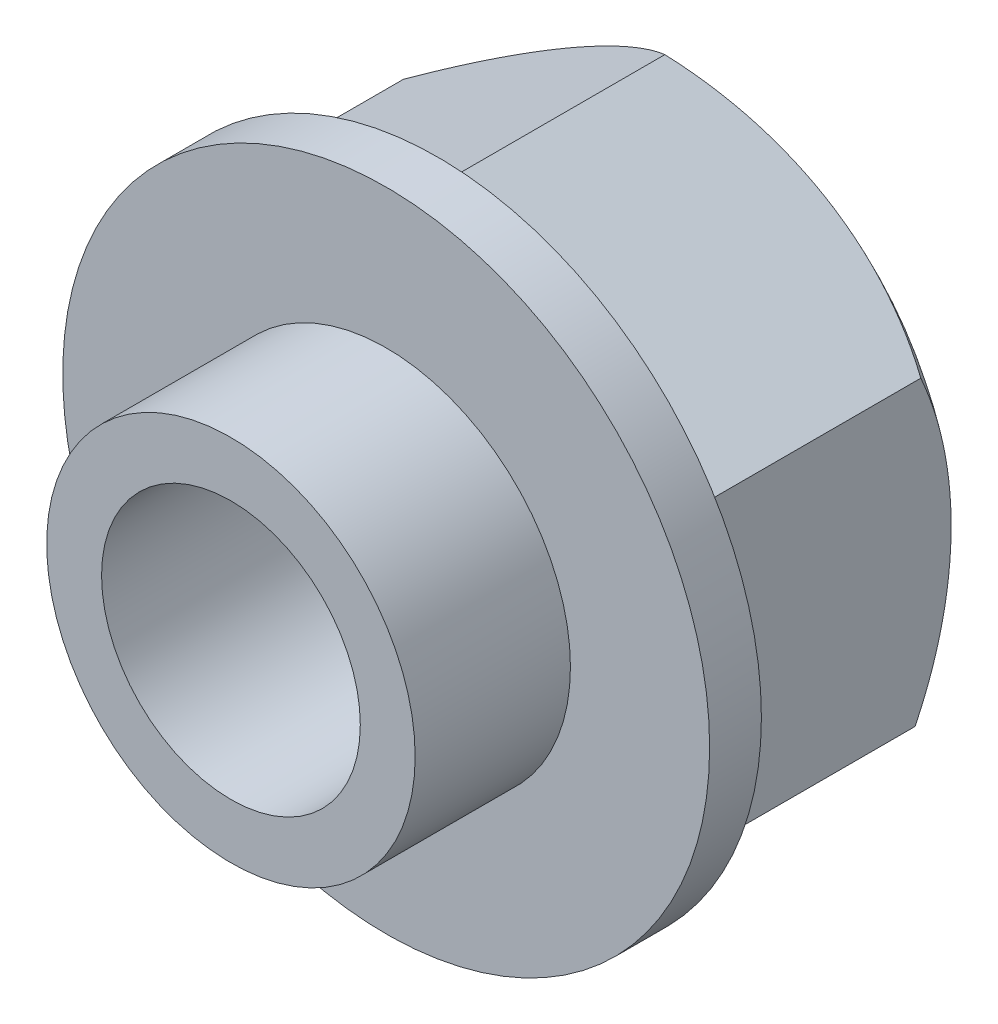
ISO-10303-21;
HEADER;
FILE_DESCRIPTION(('STEP AP214'),'2;1');
FILE_NAME('part.step','',(''),(''),'','','');
FILE_SCHEMA(('AUTOMOTIVE_DESIGN { 1 0 10303 214 1 1 1 1 }'));
ENDSEC;
DATA;
#1=APPLICATION_CONTEXT('core data for automotive mechanical design processes');
#2=APPLICATION_PROTOCOL_DEFINITION('international standard','automotive_design',2000,#1);
#3=PRODUCT_CONTEXT('',#1,'mechanical');
#4=PRODUCT('Part','Part','',(#3));
#5=PRODUCT_RELATED_PRODUCT_CATEGORY('part','',(#4));
#6=PRODUCT_DEFINITION_FORMATION('','',#4);
#7=PRODUCT_DEFINITION_CONTEXT('part definition',#1,'design');
#8=PRODUCT_DEFINITION('design','',#6,#7);
#9=PRODUCT_DEFINITION_SHAPE('','',#8);
#10=(LENGTH_UNIT() NAMED_UNIT(*) SI_UNIT(.MILLI.,.METRE.));
#11=(NAMED_UNIT(*) PLANE_ANGLE_UNIT() SI_UNIT($,.RADIAN.));
#12=(NAMED_UNIT(*) SI_UNIT($,.STERADIAN.) SOLID_ANGLE_UNIT());
#13=UNCERTAINTY_MEASURE_WITH_UNIT(LENGTH_MEASURE(1.E-05),#10,'distance_accuracy_value','');
#14=(GEOMETRIC_REPRESENTATION_CONTEXT(3) GLOBAL_UNCERTAINTY_ASSIGNED_CONTEXT((#13)) GLOBAL_UNIT_ASSIGNED_CONTEXT((#10,
#11,#12)) REPRESENTATION_CONTEXT('',''));
#15=CARTESIAN_POINT('',(0.,0.,0.));
#16=DIRECTION('',(0.,0.,1.));
#17=DIRECTION('',(1.,0.,0.));
#18=AXIS2_PLACEMENT_3D('',#15,#16,#17);
#19=CARTESIAN_POINT('',(0.,0.,0.));
#20=DIRECTION('',(0.,0.,1.));
#21=DIRECTION('',(1.,0.,0.));
#22=AXIS2_PLACEMENT_3D('',#19,#20,#21);
#23=PLANE('',#22);
#24=CARTESIAN_POINT('',(0.,0.,0.));
#25=DIRECTION('',(0.,0.,1.));
#26=DIRECTION('',(-1.,0.,0.));
#27=AXIS2_PLACEMENT_3D('',#24,#25,#26);
#28=CIRCLE('',#27,2.5);
#29=CARTESIAN_POINT('',(2.5,0.,0.));
#30=VERTEX_POINT('',#29);
#31=EDGE_CURVE('E181',#30,#30,#28,.T.);
#32=ORIENTED_EDGE('',*,*,#31,.T.);
#33=EDGE_LOOP('',(#32));
#34=FACE_BOUND('',#33,.T.);
#35=CARTESIAN_POINT('',(0.,0.118725702015422,0.));
#36=DIRECTION('',(0.,0.,-1.));
#37=DIRECTION('',(0.,-1.,0.));
#38=AXIS2_PLACEMENT_3D('',#35,#36,#37);
#39=CIRCLE('',#38,4.88355373065512);
#40=CARTESIAN_POINT('',(0.,5.00227943267054,0.));
#41=VERTEX_POINT('',#40);
#42=EDGE_CURVE('E156',#41,#41,#39,.T.);
#43=ORIENTED_EDGE('',*,*,#42,.T.);
#44=EDGE_LOOP('',(#43));
#45=FACE_BOUND('',#44,.T.);
#46=ADVANCED_FACE('F17',(#34,#45),#23,.F.);
#47=CARTESIAN_POINT('',(0.,-5.77350269189626,0.));
#48=DIRECTION('',(0.5,-0.866025403784439,0.));
#49=DIRECTION('',(0.,0.,-1.));
#50=AXIS2_PLACEMENT_3D('',#47,#48,#49);
#51=PLANE('',#50);
#52=CARTESIAN_POINT('',(2.55140973701375,-4.30044559341834,6.90751478490161));
#53=DIRECTION('',(0.5,-0.866025403784439,0.));
#54=DIRECTION('',(0.,0.,1.));
#55=AXIS2_PLACEMENT_3D('',#52,#53,#54);
#56=CIRCLE('',#55,6.74715428601685);
#57=CARTESIAN_POINT('',(0.,-5.77350269189626,0.837547561117706));
#58=VERTEX_POINT('',#57);
#59=CARTESIAN_POINT('',(5.,-2.88675134594813,0.781344263442537));
#60=VERTEX_POINT('',#59);
#61=EDGE_CURVE('E142',#58,#60,#56,.T.);
#62=ORIENTED_EDGE('',*,*,#61,.T.);
#63=DIRECTION('',(0.,0.,1.));
#64=VECTOR('',#63,1.);
#65=CARTESIAN_POINT('',(5.,-2.88675134594813,0.));
#66=LINE('',#65,#64);
#67=CARTESIAN_POINT('',(5.,-2.88675134594813,5.));
#68=VERTEX_POINT('',#67);
#69=EDGE_CURVE('E11',#60,#68,#66,.T.);
#70=ORIENTED_EDGE('',*,*,#69,.T.);
#71=DIRECTION('',(0.866025403784439,0.5,0.));
#72=VECTOR('',#71,1.);
#73=CARTESIAN_POINT('',(5.,-2.88675134594813,5.));
#74=LINE('',#73,#72);
#75=CARTESIAN_POINT('',(0.,-5.77350269189626,5.));
#76=VERTEX_POINT('',#75);
#77=EDGE_CURVE('E191',#76,#68,#74,.T.);
#78=ORIENTED_EDGE('',*,*,#77,.F.);
#79=DIRECTION('',(0.,0.,1.));
#80=VECTOR('',#79,1.);
#81=CARTESIAN_POINT('',(0.,-5.77350269189626,0.));
#82=LINE('',#81,#80);
#83=EDGE_CURVE('E20',#58,#76,#82,.T.);
#84=ORIENTED_EDGE('',*,*,#83,.F.);
#85=EDGE_LOOP('',(#62,#70,#78,#84));
#86=FACE_BOUND('',#85,.T.);
#87=ADVANCED_FACE('F209',(#86),#51,.T.);
#88=CARTESIAN_POINT('',(5.,-2.88675134594813,0.));
#89=DIRECTION('',(1.,0.,0.));
#90=DIRECTION('',(0.,-1.,0.));
#91=AXIS2_PLACEMENT_3D('',#88,#89,#90);
#92=PLANE('',#91);
#93=CARTESIAN_POINT('',(5.,0.11872570201542,6.90751478490161));
#94=DIRECTION('',(1.,0.,0.));
#95=DIRECTION('',(0.,0.,1.));
#96=AXIS2_PLACEMENT_3D('',#93,#94,#95);
#97=CIRCLE('',#96,6.82369823071256);
#98=CARTESIAN_POINT('',(5.,2.88675134594813,0.670456858414095));
#99=VERTEX_POINT('',#98);
#100=EDGE_CURVE('E153',#60,#99,#97,.T.);
#101=ORIENTED_EDGE('',*,*,#100,.T.);
#102=DIRECTION('',(0.,0.,1.));
#103=VECTOR('',#102,1.);
#104=CARTESIAN_POINT('',(5.,2.88675134594813,0.));
#105=LINE('',#104,#103);
#106=CARTESIAN_POINT('',(5.,2.88675134594813,5.));
#107=VERTEX_POINT('',#106);
#108=EDGE_CURVE('E173',#99,#107,#105,.T.);
#109=ORIENTED_EDGE('',*,*,#108,.T.);
#110=DIRECTION('',(0.,1.,0.));
#111=VECTOR('',#110,1.);
#112=CARTESIAN_POINT('',(5.,2.88675134594813,5.));
#113=LINE('',#112,#111);
#114=EDGE_CURVE('E188',#68,#107,#113,.T.);
#115=ORIENTED_EDGE('',*,*,#114,.F.);
#116=ORIENTED_EDGE('',*,*,#69,.F.);
#117=EDGE_LOOP('',(#101,#109,#115,#116));
#118=FACE_BOUND('',#117,.T.);
#119=ADVANCED_FACE('F220',(#118),#92,.T.);
#120=CARTESIAN_POINT('',(-5.,-2.88675134594813,0.));
#121=DIRECTION('',(-0.5,-0.866025403784439,0.));
#122=DIRECTION('',(-0.866025403784439,0.5,0.));
#123=AXIS2_PLACEMENT_3D('',#120,#121,#122);
#124=PLANE('',#123);
#125=CARTESIAN_POINT('',(-2.55140973701375,-4.30044559341833,6.90751478490161));
#126=DIRECTION('',(-0.5,-0.866025403784439,0.));
#127=DIRECTION('',(0.,0.,1.));
#128=AXIS2_PLACEMENT_3D('',#125,#126,#127);
#129=CIRCLE('',#128,6.74715428601686);
#130=CARTESIAN_POINT('',(-5.,-2.88675134594813,0.781344263442528));
#131=VERTEX_POINT('',#130);
#132=EDGE_CURVE('E119',#131,#58,#129,.T.);
#133=ORIENTED_EDGE('',*,*,#132,.T.);
#134=ORIENTED_EDGE('',*,*,#83,.T.);
#135=DIRECTION('',(0.866025403784439,-0.5,0.));
#136=VECTOR('',#135,1.);
#137=CARTESIAN_POINT('',(0.,-5.77350269189626,5.));
#138=LINE('',#137,#136);
#139=CARTESIAN_POINT('',(-5.,-2.88675134594813,5.));
#140=VERTEX_POINT('',#139);
#141=EDGE_CURVE('E121',#140,#76,#138,.T.);
#142=ORIENTED_EDGE('',*,*,#141,.F.);
#143=DIRECTION('',(0.,0.,1.));
#144=VECTOR('',#143,1.);
#145=CARTESIAN_POINT('',(-5.,-2.88675134594813,0.));
#146=LINE('',#145,#144);
#147=EDGE_CURVE('E115',#131,#140,#146,.T.);
#148=ORIENTED_EDGE('',*,*,#147,.F.);
#149=EDGE_LOOP('',(#133,#134,#142,#148));
#150=FACE_BOUND('',#149,.T.);
#151=ADVANCED_FACE('F117',(#150),#124,.T.);
#152=CARTESIAN_POINT('',(0.,0.,6.));
#153=DIRECTION('',(0.,0.,1.));
#154=DIRECTION('',(1.,0.,0.));
#155=AXIS2_PLACEMENT_3D('',#152,#153,#154);
#156=PLANE('',#155);
#157=CARTESIAN_POINT('',(0.,0.,6.));
#158=DIRECTION('',(0.,0.,1.));
#159=DIRECTION('',(-1.,0.,0.));
#160=AXIS2_PLACEMENT_3D('',#157,#158,#159);
#161=CIRCLE('',#160,6.25);
#162=CARTESIAN_POINT('',(6.25,0.,6.));
#163=VERTEX_POINT('',#162);
#164=EDGE_CURVE('E36',#163,#163,#161,.T.);
#165=ORIENTED_EDGE('',*,*,#164,.T.);
#166=EDGE_LOOP('',(#165));
#167=FACE_BOUND('',#166,.T.);
#168=CARTESIAN_POINT('',(0.,0.,6.));
#169=DIRECTION('',(0.,0.,-1.));
#170=DIRECTION('',(-1.,0.,0.));
#171=AXIS2_PLACEMENT_3D('',#168,#169,#170);
#172=CIRCLE('',#171,3.56);
#173=CARTESIAN_POINT('',(3.56,0.,6.));
#174=VERTEX_POINT('',#173);
#175=EDGE_CURVE('E194',#174,#174,#172,.T.);
#176=ORIENTED_EDGE('',*,*,#175,.T.);
#177=EDGE_LOOP('',(#176));
#178=FACE_BOUND('',#177,.T.);
#179=ADVANCED_FACE('F229',(#167,#178),#156,.T.);
#180=CARTESIAN_POINT('',(0.,0.,5.));
#181=DIRECTION('',(0.,0.,1.));
#182=DIRECTION('',(-1.,0.,0.));
#183=AXIS2_PLACEMENT_3D('',#180,#181,#182);
#184=CYLINDRICAL_SURFACE('',#183,6.25);
#185=CARTESIAN_POINT('',(0.,0.,5.));
#186=DIRECTION('',(0.,0.,-1.));
#187=DIRECTION('',(-1.,0.,0.));
#188=AXIS2_PLACEMENT_3D('',#185,#186,#187);
#189=CIRCLE('',#188,6.25);
#190=CARTESIAN_POINT('',(6.25,0.,5.));
#191=VERTEX_POINT('',#190);
#192=EDGE_CURVE('E197',#191,#191,#189,.T.);
#193=ORIENTED_EDGE('',*,*,#192,.F.);
#194=EDGE_LOOP('',(#193));
#195=FACE_BOUND('',#194,.T.);
#196=ORIENTED_EDGE('',*,*,#164,.F.);
#197=EDGE_LOOP('',(#196));
#198=FACE_BOUND('',#197,.T.);
#199=ADVANCED_FACE('F249',(#195,#198),#184,.T.);
#200=CARTESIAN_POINT('',(0.,0.,5.));
#201=DIRECTION('',(0.,0.,1.));
#202=DIRECTION('',(1.,0.,0.));
#203=AXIS2_PLACEMENT_3D('',#200,#201,#202);
#204=PLANE('',#203);
#205=ORIENTED_EDGE('',*,*,#141,.T.);
#206=ORIENTED_EDGE('',*,*,#77,.T.);
#207=ORIENTED_EDGE('',*,*,#114,.T.);
#208=DIRECTION('',(-0.866025403784439,0.5,0.));
#209=VECTOR('',#208,1.);
#210=CARTESIAN_POINT('',(0.,5.77350269189626,5.));
#211=LINE('',#210,#209);
#212=CARTESIAN_POINT('',(0.,5.77350269189626,5.));
#213=VERTEX_POINT('',#212);
#214=EDGE_CURVE('E169',#107,#213,#211,.T.);
#215=ORIENTED_EDGE('',*,*,#214,.T.);
#216=DIRECTION('',(-0.866025403784439,-0.5,0.));
#217=VECTOR('',#216,1.);
#218=CARTESIAN_POINT('',(-5.,2.88675134594813,5.));
#219=LINE('',#218,#217);
#220=CARTESIAN_POINT('',(-5.,2.88675134594813,5.));
#221=VERTEX_POINT('',#220);
#222=EDGE_CURVE('E126',#213,#221,#219,.T.);
#223=ORIENTED_EDGE('',*,*,#222,.T.);
#224=DIRECTION('',(0.,-1.,0.));
#225=VECTOR('',#224,1.);
#226=CARTESIAN_POINT('',(-5.,-2.88675134594813,5.));
#227=LINE('',#226,#225);
#228=EDGE_CURVE('E125',#221,#140,#227,.T.);
#229=ORIENTED_EDGE('',*,*,#228,.T.);
#230=EDGE_LOOP('',(#205,#206,#207,#215,#223,#229));
#231=FACE_BOUND('',#230,.T.);
#232=ORIENTED_EDGE('',*,*,#192,.T.);
#233=EDGE_LOOP('',(#232));
#234=FACE_BOUND('',#233,.T.);
#235=ADVANCED_FACE('F211',(#231,#234),#204,.F.);
#236=CARTESIAN_POINT('',(0.,0.,9.));
#237=DIRECTION('',(0.,0.,1.));
#238=DIRECTION('',(1.,0.,0.));
#239=AXIS2_PLACEMENT_3D('',#236,#237,#238);
#240=PLANE('',#239);
#241=CARTESIAN_POINT('',(0.,0.,9.));
#242=DIRECTION('',(0.,0.,1.));
#243=DIRECTION('',(-1.,0.,0.));
#244=AXIS2_PLACEMENT_3D('',#241,#242,#243);
#245=CIRCLE('',#244,3.56);
#246=CARTESIAN_POINT('',(3.56,0.,9.));
#247=VERTEX_POINT('',#246);
#248=EDGE_CURVE('E180',#247,#247,#245,.T.);
#249=ORIENTED_EDGE('',*,*,#248,.T.);
#250=EDGE_LOOP('',(#249));
#251=FACE_BOUND('',#250,.T.);
#252=CARTESIAN_POINT('',(0.,0.,9.));
#253=DIRECTION('',(0.,0.,-1.));
#254=DIRECTION('',(-1.,0.,0.));
#255=AXIS2_PLACEMENT_3D('',#252,#253,#254);
#256=CIRCLE('',#255,2.5);
#257=CARTESIAN_POINT('',(2.5,0.,9.));
#258=VERTEX_POINT('',#257);
#259=EDGE_CURVE('E177',#258,#258,#256,.T.);
#260=ORIENTED_EDGE('',*,*,#259,.T.);
#261=EDGE_LOOP('',(#260));
#262=FACE_BOUND('',#261,.T.);
#263=ADVANCED_FACE('F253',(#251,#262),#240,.T.);
#264=CARTESIAN_POINT('',(0.,0.,6.));
#265=DIRECTION('',(0.,0.,1.));
#266=DIRECTION('',(-1.,0.,0.));
#267=AXIS2_PLACEMENT_3D('',#264,#265,#266);
#268=CYLINDRICAL_SURFACE('',#267,3.56);
#269=ORIENTED_EDGE('',*,*,#175,.F.);
#270=EDGE_LOOP('',(#269));
#271=FACE_BOUND('',#270,.T.);
#272=ORIENTED_EDGE('',*,*,#248,.F.);
#273=EDGE_LOOP('',(#272));
#274=FACE_BOUND('',#273,.T.);
#275=ADVANCED_FACE('F255',(#271,#274),#268,.T.);
#276=CARTESIAN_POINT('',(0.,0.,9.));
#277=DIRECTION('',(0.,0.,-1.));
#278=DIRECTION('',(-1.,0.,0.));
#279=AXIS2_PLACEMENT_3D('',#276,#277,#278);
#280=CYLINDRICAL_SURFACE('',#279,2.5);
#281=ORIENTED_EDGE('',*,*,#259,.F.);
#282=EDGE_LOOP('',(#281));
#283=FACE_BOUND('',#282,.T.);
#284=ORIENTED_EDGE('',*,*,#31,.F.);
#285=EDGE_LOOP('',(#284));
#286=FACE_BOUND('',#285,.T.);
#287=ADVANCED_FACE('F262',(#283,#286),#280,.F.);
#288=CARTESIAN_POINT('',(-5.,2.88675134594813,0.));
#289=DIRECTION('',(-1.,0.,0.));
#290=DIRECTION('',(0.,0.,1.));
#291=AXIS2_PLACEMENT_3D('',#288,#289,#290);
#292=PLANE('',#291);
#293=CARTESIAN_POINT('',(-5.,0.118725702015422,6.90751478490161));
#294=DIRECTION('',(-1.,0.,0.));
#295=DIRECTION('',(0.,0.,-1.));
#296=AXIS2_PLACEMENT_3D('',#293,#294,#295);
#297=CIRCLE('',#296,6.82369823071257);
#298=CARTESIAN_POINT('',(-5.,2.88675134594813,0.670456858414086));
#299=VERTEX_POINT('',#298);
#300=EDGE_CURVE('E129',#299,#131,#297,.T.);
#301=ORIENTED_EDGE('',*,*,#300,.T.);
#302=ORIENTED_EDGE('',*,*,#147,.T.);
#303=ORIENTED_EDGE('',*,*,#228,.F.);
#304=DIRECTION('',(0.,0.,1.));
#305=VECTOR('',#304,1.);
#306=CARTESIAN_POINT('',(-5.,2.88675134594813,0.));
#307=LINE('',#306,#305);
#308=EDGE_CURVE('E132',#299,#221,#307,.T.);
#309=ORIENTED_EDGE('',*,*,#308,.F.);
#310=EDGE_LOOP('',(#301,#302,#303,#309));
#311=FACE_BOUND('',#310,.T.);
#312=ADVANCED_FACE('F130',(#311),#292,.T.);
#313=CARTESIAN_POINT('',(0.,5.77350269189626,0.));
#314=DIRECTION('',(-0.5,0.866025403784439,0.));
#315=DIRECTION('',(0.,0.,1.));
#316=AXIS2_PLACEMENT_3D('',#313,#314,#315);
#317=PLANE('',#316);
#318=CARTESIAN_POINT('',(-2.44859026298625,4.35980844442604,6.90751478490161));
#319=DIRECTION('',(-0.5,0.866025403784439,0.));
#320=DIRECTION('',(0.,0.,-1.));
#321=AXIS2_PLACEMENT_3D('',#318,#319,#320);
#322=CIRCLE('',#321,6.89786056976115);
#323=CARTESIAN_POINT('',(0.,5.77350269189626,0.615745976486594));
#324=VERTEX_POINT('',#323);
#325=EDGE_CURVE('E137',#324,#299,#322,.T.);
#326=ORIENTED_EDGE('',*,*,#325,.T.);
#327=ORIENTED_EDGE('',*,*,#308,.T.);
#328=ORIENTED_EDGE('',*,*,#222,.F.);
#329=DIRECTION('',(0.,0.,1.));
#330=VECTOR('',#329,1.);
#331=CARTESIAN_POINT('',(0.,5.77350269189626,0.));
#332=LINE('',#331,#330);
#333=EDGE_CURVE('E162',#324,#213,#332,.T.);
#334=ORIENTED_EDGE('',*,*,#333,.F.);
#335=EDGE_LOOP('',(#326,#327,#328,#334));
#336=FACE_BOUND('',#335,.T.);
#337=ADVANCED_FACE('F215',(#336),#317,.T.);
#338=CARTESIAN_POINT('',(5.,2.88675134594812,0.));
#339=DIRECTION('',(0.5,0.866025403784439,0.));
#340=DIRECTION('',(0.,0.,-1.));
#341=AXIS2_PLACEMENT_3D('',#338,#339,#340);
#342=PLANE('',#341);
#343=CARTESIAN_POINT('',(2.44859026298625,4.35980844442605,6.90751478490161));
#344=DIRECTION('',(0.5,0.866025403784439,0.));
#345=DIRECTION('',(0.,0.,-1.));
#346=AXIS2_PLACEMENT_3D('',#343,#344,#345);
#347=CIRCLE('',#346,6.89786056976114);
#348=EDGE_CURVE('E148',#99,#324,#347,.T.);
#349=ORIENTED_EDGE('',*,*,#348,.T.);
#350=ORIENTED_EDGE('',*,*,#333,.T.);
#351=ORIENTED_EDGE('',*,*,#214,.F.);
#352=ORIENTED_EDGE('',*,*,#108,.F.);
#353=EDGE_LOOP('',(#349,#350,#351,#352));
#354=FACE_BOUND('',#353,.T.);
#355=ADVANCED_FACE('F218',(#354),#342,.T.);
#356=CARTESIAN_POINT('',(0.,0.118725702015422,6.90751478490161));
#357=DIRECTION('',(0.,0.,1.));
#358=DIRECTION('',(1.,0.,0.));
#359=AXIS2_PLACEMENT_3D('',#356,#357,#358);
#360=SPHERICAL_SURFACE('',#359,8.45948329059345);
#361=ORIENTED_EDGE('',*,*,#42,.F.);
#362=EDGE_LOOP('',(#361));
#363=FACE_BOUND('',#362,.T.);
#364=ORIENTED_EDGE('',*,*,#132,.F.);
#365=ORIENTED_EDGE('',*,*,#300,.F.);
#366=ORIENTED_EDGE('',*,*,#325,.F.);
#367=ORIENTED_EDGE('',*,*,#348,.F.);
#368=ORIENTED_EDGE('',*,*,#100,.F.);
#369=ORIENTED_EDGE('',*,*,#61,.F.);
#370=EDGE_LOOP('',(#364,#365,#366,#367,#368,#369));
#371=FACE_BOUND('',#370,.T.);
#372=ADVANCED_FACE('F140',(#363,#371),#360,.T.);
#373=CLOSED_SHELL('',(#46,#87,#119,#151,#179,#199,#235,#263,#275,#287,#312,#337,#355,#372));
#374=MANIFOLD_SOLID_BREP('B1',#373);
#375=ADVANCED_BREP_SHAPE_REPRESENTATION('',(#18,#374),#14);
#376=SHAPE_DEFINITION_REPRESENTATION(#9,#375);
ENDSEC;
END-ISO-10303-21;
